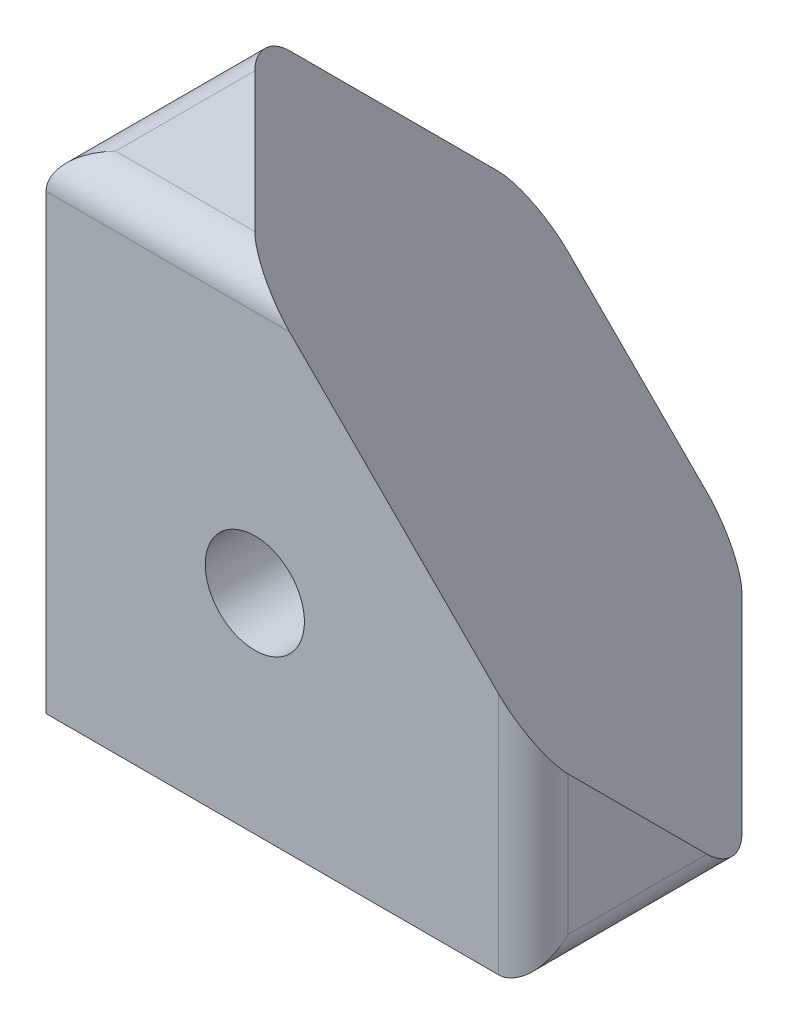
ISO-10303-21;
HEADER;
FILE_DESCRIPTION(('STEP AP214'),'2;1');
FILE_NAME('part.step','',(''),(''),'','','');
FILE_SCHEMA(('AUTOMOTIVE_DESIGN { 1 0 10303 214 1 1 1 1 }'));
ENDSEC;
DATA;
#1=APPLICATION_CONTEXT('core data for automotive mechanical design processes');
#2=APPLICATION_PROTOCOL_DEFINITION('international standard','automotive_design',2000,#1);
#3=PRODUCT_CONTEXT('',#1,'mechanical');
#4=PRODUCT('Part','Part','',(#3));
#5=PRODUCT_RELATED_PRODUCT_CATEGORY('part','',(#4));
#6=PRODUCT_DEFINITION_FORMATION('','',#4);
#7=PRODUCT_DEFINITION_CONTEXT('part definition',#1,'design');
#8=PRODUCT_DEFINITION('design','',#6,#7);
#9=PRODUCT_DEFINITION_SHAPE('','',#8);
#10=(LENGTH_UNIT() NAMED_UNIT(*) SI_UNIT(.MILLI.,.METRE.));
#11=(NAMED_UNIT(*) PLANE_ANGLE_UNIT() SI_UNIT($,.RADIAN.));
#12=(NAMED_UNIT(*) SI_UNIT($,.STERADIAN.) SOLID_ANGLE_UNIT());
#13=UNCERTAINTY_MEASURE_WITH_UNIT(LENGTH_MEASURE(1.E-05),#10,'distance_accuracy_value','');
#14=(GEOMETRIC_REPRESENTATION_CONTEXT(3) GLOBAL_UNCERTAINTY_ASSIGNED_CONTEXT((#13)) GLOBAL_UNIT_ASSIGNED_CONTEXT((#10,
#11,#12)) REPRESENTATION_CONTEXT('',''));
#15=CARTESIAN_POINT('',(0.,0.,0.));
#16=DIRECTION('',(0.,0.,1.));
#17=DIRECTION('',(1.,0.,0.));
#18=AXIS2_PLACEMENT_3D('',#15,#16,#17);
#19=CARTESIAN_POINT('',(0.,0.,0.));
#20=DIRECTION('',(-1.,0.,0.));
#21=DIRECTION('',(0.,0.,1.));
#22=AXIS2_PLACEMENT_3D('',#19,#20,#21);
#23=PLANE('',#22);
#24=CARTESIAN_POINT('',(0.,12.,-12.));
#25=DIRECTION('',(-1.,0.,0.));
#26=DIRECTION('',(0.,0.,1.));
#27=AXIS2_PLACEMENT_3D('',#24,#25,#26);
#28=CIRCLE('',#27,2.85);
#29=CARTESIAN_POINT('',(0.,12.,-9.15));
#30=VERTEX_POINT('',#29);
#31=EDGE_CURVE('E308',#30,#30,#28,.T.);
#32=ORIENTED_EDGE('',*,*,#31,.F.);
#33=EDGE_LOOP('',(#32));
#34=FACE_BOUND('',#33,.T.);
#35=DIRECTION('',(0.,0.707106781186548,0.707106781186548));
#36=VECTOR('',#35,1.);
#37=CARTESIAN_POINT('',(0.,40.,0.));
#38=LINE('',#37,#36);
#39=CARTESIAN_POINT('',(0.,14.,-26.));
#40=VERTEX_POINT('',#39);
#41=CARTESIAN_POINT('',(0.,26.,-14.));
#42=VERTEX_POINT('',#41);
#43=EDGE_CURVE('E139',#40,#42,#38,.T.);
#44=ORIENTED_EDGE('',*,*,#43,.F.);
#45=DIRECTION('',(0.,1.,0.));
#46=VECTOR('',#45,1.);
#47=CARTESIAN_POINT('',(0.,0.,-26.));
#48=LINE('',#47,#46);
#49=CARTESIAN_POINT('',(0.,0.,-26.));
#50=VERTEX_POINT('',#49);
#51=EDGE_CURVE('E155',#40,#50,#48,.F.);
#52=ORIENTED_EDGE('',*,*,#51,.T.);
#53=DIRECTION('',(0.,0.,-1.));
#54=VECTOR('',#53,1.);
#55=CARTESIAN_POINT('',(0.,0.,-40.));
#56=LINE('',#55,#54);
#57=CARTESIAN_POINT('',(0.,0.,0.));
#58=VERTEX_POINT('',#57);
#59=EDGE_CURVE('E140',#58,#50,#56,.T.);
#60=ORIENTED_EDGE('',*,*,#59,.F.);
#61=DIRECTION('',(0.,-1.,0.));
#62=VECTOR('',#61,1.);
#63=CARTESIAN_POINT('',(0.,0.,0.));
#64=LINE('',#63,#62);
#65=CARTESIAN_POINT('',(0.,26.,0.));
#66=VERTEX_POINT('',#65);
#67=EDGE_CURVE('E128',#66,#58,#64,.T.);
#68=ORIENTED_EDGE('',*,*,#67,.F.);
#69=DIRECTION('',(0.,0.,1.));
#70=VECTOR('',#69,1.);
#71=CARTESIAN_POINT('',(0.,26.,-12.));
#72=LINE('',#71,#70);
#73=EDGE_CURVE('E238',#66,#42,#72,.F.);
#74=ORIENTED_EDGE('',*,*,#73,.T.);
#75=EDGE_LOOP('',(#44,#52,#60,#68,#74));
#76=FACE_BOUND('',#75,.T.);
#77=ADVANCED_FACE('F49',(#34,#76),#23,.T.);
#78=CARTESIAN_POINT('',(0.,0.,0.));
#79=DIRECTION('',(0.,0.,-1.));
#80=DIRECTION('',(-1.,0.,0.));
#81=AXIS2_PLACEMENT_3D('',#78,#79,#80);
#82=PLANE('',#81);
#83=CARTESIAN_POINT('',(12.,12.,0.));
#84=DIRECTION('',(0.,0.,-1.));
#85=DIRECTION('',(-1.,0.,0.));
#86=AXIS2_PLACEMENT_3D('',#83,#84,#85);
#87=CIRCLE('',#86,2.85);
#88=CARTESIAN_POINT('',(9.15,12.,0.));
#89=VERTEX_POINT('',#88);
#90=EDGE_CURVE('E317',#89,#89,#87,.T.);
#91=ORIENTED_EDGE('',*,*,#90,.T.);
#92=EDGE_LOOP('',(#91));
#93=FACE_BOUND('',#92,.T.);
#94=DIRECTION('',(1.,0.,0.));
#95=VECTOR('',#94,1.);
#96=CARTESIAN_POINT('',(40.,0.,0.));
#97=LINE('',#96,#95);
#98=CARTESIAN_POINT('',(26.,0.,0.));
#99=VERTEX_POINT('',#98);
#100=EDGE_CURVE('E130',#58,#99,#97,.T.);
#101=ORIENTED_EDGE('',*,*,#100,.T.);
#102=DIRECTION('',(0.,-1.,0.));
#103=VECTOR('',#102,1.);
#104=CARTESIAN_POINT('',(26.,0.,0.));
#105=LINE('',#104,#103);
#106=CARTESIAN_POINT('',(26.,14.,0.));
#107=VERTEX_POINT('',#106);
#108=EDGE_CURVE('E212',#99,#107,#105,.F.);
#109=ORIENTED_EDGE('',*,*,#108,.T.);
#110=DIRECTION('',(-0.707106781186548,0.707106781186548,0.));
#111=VECTOR('',#110,1.);
#112=CARTESIAN_POINT('',(0.,40.,0.));
#113=LINE('',#112,#111);
#114=CARTESIAN_POINT('',(14.,26.,0.));
#115=VERTEX_POINT('',#114);
#116=EDGE_CURVE('E53',#107,#115,#113,.T.);
#117=ORIENTED_EDGE('',*,*,#116,.T.);
#118=DIRECTION('',(1.,0.,0.));
#119=VECTOR('',#118,1.);
#120=CARTESIAN_POINT('',(0.,26.,0.));
#121=LINE('',#120,#119);
#122=EDGE_CURVE('E134',#115,#66,#121,.F.);
#123=ORIENTED_EDGE('',*,*,#122,.T.);
#124=ORIENTED_EDGE('',*,*,#67,.T.);
#125=EDGE_LOOP('',(#101,#109,#117,#123,#124));
#126=FACE_BOUND('',#125,.T.);
#127=ADVANCED_FACE('F129',(#93,#126),#82,.F.);
#128=CARTESIAN_POINT('',(0.,40.,0.));
#129=DIRECTION('',(0.577350269189626,0.577350269189626,-0.577350269189626));
#130=DIRECTION('',(0.707106781186547,-0.707106781186547,0.));
#131=AXIS2_PLACEMENT_3D('',#128,#129,#130);
#132=PLANE('',#131);
#133=DIRECTION('',(0.707106781186548,-0.707106781186548,0.));
#134=VECTOR('',#133,1.);
#135=CARTESIAN_POINT('',(-14.,26.,-28.));
#136=LINE('',#135,#134);
#137=CARTESIAN_POINT('',(2.,9.99999999999997,-28.));
#138=VERTEX_POINT('',#137);
#139=CARTESIAN_POINT('',(9.99999999999998,2.,-28.));
#140=VERTEX_POINT('',#139);
#141=EDGE_CURVE('E320',#138,#140,#136,.T.);
#142=ORIENTED_EDGE('',*,*,#141,.F.);
#143=CARTESIAN_POINT('',(2.,12.,-26.));
#144=DIRECTION('',(0.577350269189626,0.577350269189626,-0.577350269189626));
#145=DIRECTION('',(0.408248290463863,-0.816496580927726,-0.408248290463863));
#146=AXIS2_PLACEMENT_3D('',#143,#144,#145);
#147=ELLIPSE('',#146,3.46410161513776,2.);
#148=EDGE_CURVE('E225',#138,#40,#147,.T.);
#149=ORIENTED_EDGE('',*,*,#148,.T.);
#150=ORIENTED_EDGE('',*,*,#43,.T.);
#151=CARTESIAN_POINT('',(2.,26.,-12.));
#152=DIRECTION('',(0.577350269189626,0.577350269189626,-0.577350269189626));
#153=DIRECTION('',(-0.408248290463863,-0.408248290463863,-0.816496580927726));
#154=AXIS2_PLACEMENT_3D('',#151,#152,#153);
#155=ELLIPSE('',#154,3.46410161513775,2.);
#156=CARTESIAN_POINT('',(2.,28.,-9.99999999999999));
#157=VERTEX_POINT('',#156);
#158=EDGE_CURVE('E220',#42,#157,#155,.T.);
#159=ORIENTED_EDGE('',*,*,#158,.T.);
#160=DIRECTION('',(-0.707106781186548,0.,-0.707106781186547));
#161=VECTOR('',#160,1.);
#162=CARTESIAN_POINT('',(5.99999999999999,28.,-6.));
#163=LINE('',#162,#161);
#164=CARTESIAN_POINT('',(10.,28.,-2.));
#165=VERTEX_POINT('',#164);
#166=EDGE_CURVE('E278',#165,#157,#163,.T.);
#167=ORIENTED_EDGE('',*,*,#166,.F.);
#168=CARTESIAN_POINT('',(12.,26.,-2.));
#169=DIRECTION('',(0.577350269189626,0.577350269189626,-0.577350269189626));
#170=DIRECTION('',(0.816496580927726,-0.408248290463863,0.408248290463863));
#171=AXIS2_PLACEMENT_3D('',#168,#169,#170);
#172=ELLIPSE('',#171,3.46410161513776,2.);
#173=EDGE_CURVE('E331',#165,#115,#172,.T.);
#174=ORIENTED_EDGE('',*,*,#173,.T.);
#175=ORIENTED_EDGE('',*,*,#116,.F.);
#176=CARTESIAN_POINT('',(26.,12.,-2.));
#177=DIRECTION('',(0.577350269189626,0.577350269189626,-0.577350269189626));
#178=DIRECTION('',(0.408248290463863,-0.816496580927726,-0.408248290463863));
#179=AXIS2_PLACEMENT_3D('',#176,#177,#178);
#180=ELLIPSE('',#179,3.46410161513776,2.);
#181=CARTESIAN_POINT('',(28.,10.,-1.99999999999999));
#182=VERTEX_POINT('',#181);
#183=EDGE_CURVE('E211',#107,#182,#180,.T.);
#184=ORIENTED_EDGE('',*,*,#183,.T.);
#185=DIRECTION('',(0.,0.707106781186548,0.707106781186547));
#186=VECTOR('',#185,1.);
#187=CARTESIAN_POINT('',(28.,26.,14.));
#188=LINE('',#187,#186);
#189=CARTESIAN_POINT('',(28.,2.,-9.99999999999999));
#190=VERTEX_POINT('',#189);
#191=EDGE_CURVE('E148',#190,#182,#188,.T.);
#192=ORIENTED_EDGE('',*,*,#191,.F.);
#193=CARTESIAN_POINT('',(26.,2.,-12.));
#194=DIRECTION('',(0.577350269189626,0.577350269189626,-0.577350269189626));
#195=DIRECTION('',(0.408248290463863,0.408248290463863,0.816496580927726));
#196=AXIS2_PLACEMENT_3D('',#193,#194,#195);
#197=ELLIPSE('',#196,3.46410161513775,2.);
#198=CARTESIAN_POINT('',(26.,0.,-14.));
#199=VERTEX_POINT('',#198);
#200=EDGE_CURVE('E221',#190,#199,#197,.T.);
#201=ORIENTED_EDGE('',*,*,#200,.T.);
#202=DIRECTION('',(-0.707106781186548,0.,-0.707106781186548));
#203=VECTOR('',#202,1.);
#204=CARTESIAN_POINT('',(20.,0.,-20.));
#205=LINE('',#204,#203);
#206=CARTESIAN_POINT('',(14.,0.,-26.));
#207=VERTEX_POINT('',#206);
#208=EDGE_CURVE('E157',#199,#207,#205,.T.);
#209=ORIENTED_EDGE('',*,*,#208,.T.);
#210=CARTESIAN_POINT('',(12.,2.,-26.));
#211=DIRECTION('',(0.577350269189626,0.577350269189626,-0.577350269189626));
#212=DIRECTION('',(0.816496580927726,-0.408248290463863,0.408248290463863));
#213=AXIS2_PLACEMENT_3D('',#210,#211,#212);
#214=ELLIPSE('',#213,3.46410161513776,2.);
#215=EDGE_CURVE('E227',#207,#140,#214,.T.);
#216=ORIENTED_EDGE('',*,*,#215,.T.);
#217=EDGE_LOOP('',(#142,#149,#150,#159,#167,#174,#175,#184,#192,#201,#209,#216));
#218=FACE_BOUND('',#217,.T.);
#219=ADVANCED_FACE('F260',(#218),#132,.T.);
#220=CARTESIAN_POINT('',(40.,0.,0.));
#221=DIRECTION('',(0.,-1.,0.));
#222=DIRECTION('',(-1.,0.,0.));
#223=AXIS2_PLACEMENT_3D('',#220,#221,#222);
#224=PLANE('',#223);
#225=ORIENTED_EDGE('',*,*,#208,.F.);
#226=DIRECTION('',(0.,0.,-1.));
#227=VECTOR('',#226,1.);
#228=CARTESIAN_POINT('',(26.,0.,0.));
#229=LINE('',#228,#227);
#230=EDGE_CURVE('E12',#199,#99,#229,.F.);
#231=ORIENTED_EDGE('',*,*,#230,.T.);
#232=ORIENTED_EDGE('',*,*,#100,.F.);
#233=ORIENTED_EDGE('',*,*,#59,.T.);
#234=DIRECTION('',(-1.,0.,0.));
#235=VECTOR('',#234,1.);
#236=CARTESIAN_POINT('',(12.,0.,-26.));
#237=LINE('',#236,#235);
#238=EDGE_CURVE('E60',#50,#207,#237,.F.);
#239=ORIENTED_EDGE('',*,*,#238,.T.);
#240=EDGE_LOOP('',(#225,#231,#232,#233,#239));
#241=FACE_BOUND('',#240,.T.);
#242=ADVANCED_FACE('F144',(#241),#224,.T.);
#243=CARTESIAN_POINT('',(28.,0.,-20.));
#244=DIRECTION('',(-1.,0.,0.));
#245=DIRECTION('',(0.,0.,1.));
#246=AXIS2_PLACEMENT_3D('',#243,#244,#245);
#247=PLANE('',#246);
#248=ORIENTED_EDGE('',*,*,#191,.T.);
#249=DIRECTION('',(0.,-1.,0.));
#250=VECTOR('',#249,1.);
#251=CARTESIAN_POINT('',(28.,0.,-2.));
#252=LINE('',#251,#250);
#253=CARTESIAN_POINT('',(28.,2.,-2.));
#254=VERTEX_POINT('',#253);
#255=EDGE_CURVE('E214',#182,#254,#252,.T.);
#256=ORIENTED_EDGE('',*,*,#255,.T.);
#257=DIRECTION('',(0.,0.,-1.));
#258=VECTOR('',#257,1.);
#259=CARTESIAN_POINT('',(28.,2.,-12.));
#260=LINE('',#259,#258);
#261=EDGE_CURVE('E394',#254,#190,#260,.T.);
#262=ORIENTED_EDGE('',*,*,#261,.T.);
#263=EDGE_LOOP('',(#248,#256,#262));
#264=FACE_BOUND('',#263,.T.);
#265=ADVANCED_FACE('F420',(#264),#247,.F.);
#266=CARTESIAN_POINT('',(0.,28.,-20.));
#267=DIRECTION('',(0.,-1.,0.));
#268=DIRECTION('',(1.,0.,0.));
#269=AXIS2_PLACEMENT_3D('',#266,#267,#268);
#270=PLANE('',#269);
#271=ORIENTED_EDGE('',*,*,#166,.T.);
#272=DIRECTION('',(0.,0.,1.));
#273=VECTOR('',#272,1.);
#274=CARTESIAN_POINT('',(2.,28.,0.));
#275=LINE('',#274,#273);
#276=CARTESIAN_POINT('',(2.,28.,-2.));
#277=VERTEX_POINT('',#276);
#278=EDGE_CURVE('E388',#157,#277,#275,.T.);
#279=ORIENTED_EDGE('',*,*,#278,.T.);
#280=DIRECTION('',(1.,0.,0.));
#281=VECTOR('',#280,1.);
#282=CARTESIAN_POINT('',(0.,28.,-2.));
#283=LINE('',#282,#281);
#284=EDGE_CURVE('E390',#277,#165,#283,.T.);
#285=ORIENTED_EDGE('',*,*,#284,.T.);
#286=EDGE_LOOP('',(#271,#279,#285));
#287=FACE_BOUND('',#286,.T.);
#288=ADVANCED_FACE('F262',(#287),#270,.F.);
#289=CARTESIAN_POINT('',(20.,0.,-28.));
#290=DIRECTION('',(0.,0.,1.));
#291=DIRECTION('',(1.,0.,0.));
#292=AXIS2_PLACEMENT_3D('',#289,#290,#291);
#293=PLANE('',#292);
#294=DIRECTION('',(-1.,0.,0.));
#295=VECTOR('',#294,1.);
#296=CARTESIAN_POINT('',(0.,2.,-28.));
#297=LINE('',#296,#295);
#298=CARTESIAN_POINT('',(2.,2.,-28.));
#299=VERTEX_POINT('',#298);
#300=EDGE_CURVE('E324',#140,#299,#297,.T.);
#301=ORIENTED_EDGE('',*,*,#300,.T.);
#302=DIRECTION('',(0.,1.,0.));
#303=VECTOR('',#302,1.);
#304=CARTESIAN_POINT('',(2.,12.,-28.));
#305=LINE('',#304,#303);
#306=EDGE_CURVE('E327',#299,#138,#305,.T.);
#307=ORIENTED_EDGE('',*,*,#306,.T.);
#308=ORIENTED_EDGE('',*,*,#141,.T.);
#309=EDGE_LOOP('',(#301,#307,#308));
#310=FACE_BOUND('',#309,.T.);
#311=ADVANCED_FACE('F191',(#310),#293,.F.);
#312=CARTESIAN_POINT('',(20.,2.,-26.));
#313=DIRECTION('',(1.,0.,0.));
#314=DIRECTION('',(0.,0.,-1.));
#315=AXIS2_PLACEMENT_3D('',#312,#313,#314);
#316=CYLINDRICAL_SURFACE('',#315,2.);
#317=ORIENTED_EDGE('',*,*,#215,.F.);
#318=ORIENTED_EDGE('',*,*,#238,.F.);
#319=CARTESIAN_POINT('',(2.,2.,-26.));
#320=DIRECTION('',(0.707106781186547,-0.707106781186547,0.));
#321=DIRECTION('',(0.707106781186547,0.707106781186547,0.));
#322=AXIS2_PLACEMENT_3D('',#319,#320,#321);
#323=ELLIPSE('',#322,2.82842712474619,2.);
#324=EDGE_CURVE('E306',#299,#50,#323,.F.);
#325=ORIENTED_EDGE('',*,*,#324,.F.);
#326=ORIENTED_EDGE('',*,*,#300,.F.);
#327=EDGE_LOOP('',(#317,#318,#325,#326));
#328=FACE_BOUND('',#327,.T.);
#329=ADVANCED_FACE('F187',(#328),#316,.T.);
#330=CARTESIAN_POINT('',(2.,0.,-26.));
#331=DIRECTION('',(0.,-1.,0.));
#332=DIRECTION('',(0.,0.,-1.));
#333=AXIS2_PLACEMENT_3D('',#330,#331,#332);
#334=CYLINDRICAL_SURFACE('',#333,2.);
#335=ORIENTED_EDGE('',*,*,#324,.T.);
#336=ORIENTED_EDGE('',*,*,#51,.F.);
#337=ORIENTED_EDGE('',*,*,#148,.F.);
#338=ORIENTED_EDGE('',*,*,#306,.F.);
#339=EDGE_LOOP('',(#335,#336,#337,#338));
#340=FACE_BOUND('',#339,.T.);
#341=ADVANCED_FACE('F182',(#340),#334,.T.);
#342=CARTESIAN_POINT('',(0.,26.,-2.));
#343=DIRECTION('',(1.,0.,0.));
#344=DIRECTION('',(0.,1.,0.));
#345=AXIS2_PLACEMENT_3D('',#342,#343,#344);
#346=CYLINDRICAL_SURFACE('',#345,2.);
#347=ORIENTED_EDGE('',*,*,#173,.F.);
#348=ORIENTED_EDGE('',*,*,#284,.F.);
#349=CARTESIAN_POINT('',(2.,26.,-2.));
#350=DIRECTION('',(0.707106781186547,0.,0.707106781186547));
#351=DIRECTION('',(0.707106781186547,0.,-0.707106781186547));
#352=AXIS2_PLACEMENT_3D('',#349,#350,#351);
#353=ELLIPSE('',#352,2.82842712474619,2.);
#354=EDGE_CURVE('E301',#66,#277,#353,.F.);
#355=ORIENTED_EDGE('',*,*,#354,.F.);
#356=ORIENTED_EDGE('',*,*,#122,.F.);
#357=EDGE_LOOP('',(#347,#348,#355,#356));
#358=FACE_BOUND('',#357,.T.);
#359=ADVANCED_FACE('F186',(#358),#346,.T.);
#360=CARTESIAN_POINT('',(2.,26.,-20.));
#361=DIRECTION('',(0.,0.,-1.));
#362=DIRECTION('',(-1.,0.,0.));
#363=AXIS2_PLACEMENT_3D('',#360,#361,#362);
#364=CYLINDRICAL_SURFACE('',#363,2.);
#365=ORIENTED_EDGE('',*,*,#158,.F.);
#366=ORIENTED_EDGE('',*,*,#73,.F.);
#367=ORIENTED_EDGE('',*,*,#354,.T.);
#368=ORIENTED_EDGE('',*,*,#278,.F.);
#369=EDGE_LOOP('',(#365,#366,#367,#368));
#370=FACE_BOUND('',#369,.T.);
#371=ADVANCED_FACE('F193',(#370),#364,.T.);
#372=CARTESIAN_POINT('',(26.,2.,-20.));
#373=DIRECTION('',(0.,0.,1.));
#374=DIRECTION('',(1.,0.,0.));
#375=AXIS2_PLACEMENT_3D('',#372,#373,#374);
#376=CYLINDRICAL_SURFACE('',#375,2.);
#377=ORIENTED_EDGE('',*,*,#200,.F.);
#378=ORIENTED_EDGE('',*,*,#261,.F.);
#379=CARTESIAN_POINT('',(26.,2.,-2.));
#380=DIRECTION('',(0.,0.707106781186547,0.707106781186547));
#381=DIRECTION('',(0.,-0.707106781186547,0.707106781186547));
#382=AXIS2_PLACEMENT_3D('',#379,#380,#381);
#383=ELLIPSE('',#382,2.82842712474619,2.);
#384=EDGE_CURVE('E74',#99,#254,#383,.T.);
#385=ORIENTED_EDGE('',*,*,#384,.F.);
#386=ORIENTED_EDGE('',*,*,#230,.F.);
#387=EDGE_LOOP('',(#377,#378,#385,#386));
#388=FACE_BOUND('',#387,.T.);
#389=ADVANCED_FACE('F51',(#388),#376,.T.);
#390=CARTESIAN_POINT('',(26.,0.,-2.));
#391=DIRECTION('',(0.,-1.,0.));
#392=DIRECTION('',(0.,0.,-1.));
#393=AXIS2_PLACEMENT_3D('',#390,#391,#392);
#394=CYLINDRICAL_SURFACE('',#393,2.);
#395=ORIENTED_EDGE('',*,*,#183,.F.);
#396=ORIENTED_EDGE('',*,*,#108,.F.);
#397=ORIENTED_EDGE('',*,*,#384,.T.);
#398=ORIENTED_EDGE('',*,*,#255,.F.);
#399=EDGE_LOOP('',(#395,#396,#397,#398));
#400=FACE_BOUND('',#399,.T.);
#401=ADVANCED_FACE('F199',(#400),#394,.T.);
#402=CARTESIAN_POINT('',(8.,12.,-12.));
#403=DIRECTION('',(-1.,0.,0.));
#404=DIRECTION('',(0.,0.,1.));
#405=AXIS2_PLACEMENT_3D('',#402,#403,#404);
#406=CYLINDRICAL_SURFACE('',#405,2.85);
#407=CARTESIAN_POINT('',(8.,12.,-12.));
#408=DIRECTION('',(-1.,0.,0.));
#409=DIRECTION('',(0.,0.,1.));
#410=AXIS2_PLACEMENT_3D('',#407,#408,#409);
#411=CIRCLE('',#410,2.85);
#412=CARTESIAN_POINT('',(8.,12.,-9.15));
#413=VERTEX_POINT('',#412);
#414=EDGE_CURVE('E302',#413,#413,#411,.T.);
#415=ORIENTED_EDGE('',*,*,#414,.F.);
#416=EDGE_LOOP('',(#415));
#417=FACE_BOUND('',#416,.T.);
#418=ORIENTED_EDGE('',*,*,#31,.T.);
#419=EDGE_LOOP('',(#418));
#420=FACE_BOUND('',#419,.T.);
#421=ADVANCED_FACE('F201',(#417,#420),#406,.F.);
#422=CARTESIAN_POINT('',(8.,12.,-12.));
#423=DIRECTION('',(-1.,0.,0.));
#424=DIRECTION('',(0.,0.,1.));
#425=AXIS2_PLACEMENT_3D('',#422,#423,#424);
#426=PLANE('',#425);
#427=ORIENTED_EDGE('',*,*,#414,.T.);
#428=EDGE_LOOP('',(#427));
#429=FACE_BOUND('',#428,.T.);
#430=ADVANCED_FACE('F206',(#429),#426,.T.);
#431=CARTESIAN_POINT('',(12.,12.,-7.99999999999996));
#432=DIRECTION('',(0.,0.,1.));
#433=DIRECTION('',(1.,0.,0.));
#434=AXIS2_PLACEMENT_3D('',#431,#432,#433);
#435=CYLINDRICAL_SURFACE('',#434,2.85);
#436=CARTESIAN_POINT('',(12.,12.,-7.99999999999996));
#437=DIRECTION('',(0.,0.,-1.));
#438=DIRECTION('',(-1.,0.,0.));
#439=AXIS2_PLACEMENT_3D('',#436,#437,#438);
#440=CIRCLE('',#439,2.85);
#441=CARTESIAN_POINT('',(9.15000000000003,12.,-7.99999999999997));
#442=VERTEX_POINT('',#441);
#443=EDGE_CURVE('E314',#442,#442,#440,.T.);
#444=ORIENTED_EDGE('',*,*,#443,.T.);
#445=EDGE_LOOP('',(#444));
#446=FACE_BOUND('',#445,.T.);
#447=ORIENTED_EDGE('',*,*,#90,.F.);
#448=EDGE_LOOP('',(#447));
#449=FACE_BOUND('',#448,.T.);
#450=ADVANCED_FACE('F434',(#446,#449),#435,.F.);
#451=CARTESIAN_POINT('',(12.,12.,-7.99999999999996));
#452=DIRECTION('',(0.,0.,1.));
#453=DIRECTION('',(-1.,0.,0.));
#454=AXIS2_PLACEMENT_3D('',#451,#452,#453);
#455=PLANE('',#454);
#456=ORIENTED_EDGE('',*,*,#443,.F.);
#457=EDGE_LOOP('',(#456));
#458=FACE_BOUND('',#457,.T.);
#459=ADVANCED_FACE('F437',(#458),#455,.T.);
#460=CLOSED_SHELL('',(#77,#127,#219,#242,#265,#288,#311,#329,#341,#359,#371,#389,#401,#421,#430,
#450,#459));
#461=MANIFOLD_SOLID_BREP('B2',#460);
#462=ADVANCED_BREP_SHAPE_REPRESENTATION('',(#18,#461),#14);
#463=SHAPE_DEFINITION_REPRESENTATION(#9,#462);
ENDSEC;
END-ISO-10303-21;
